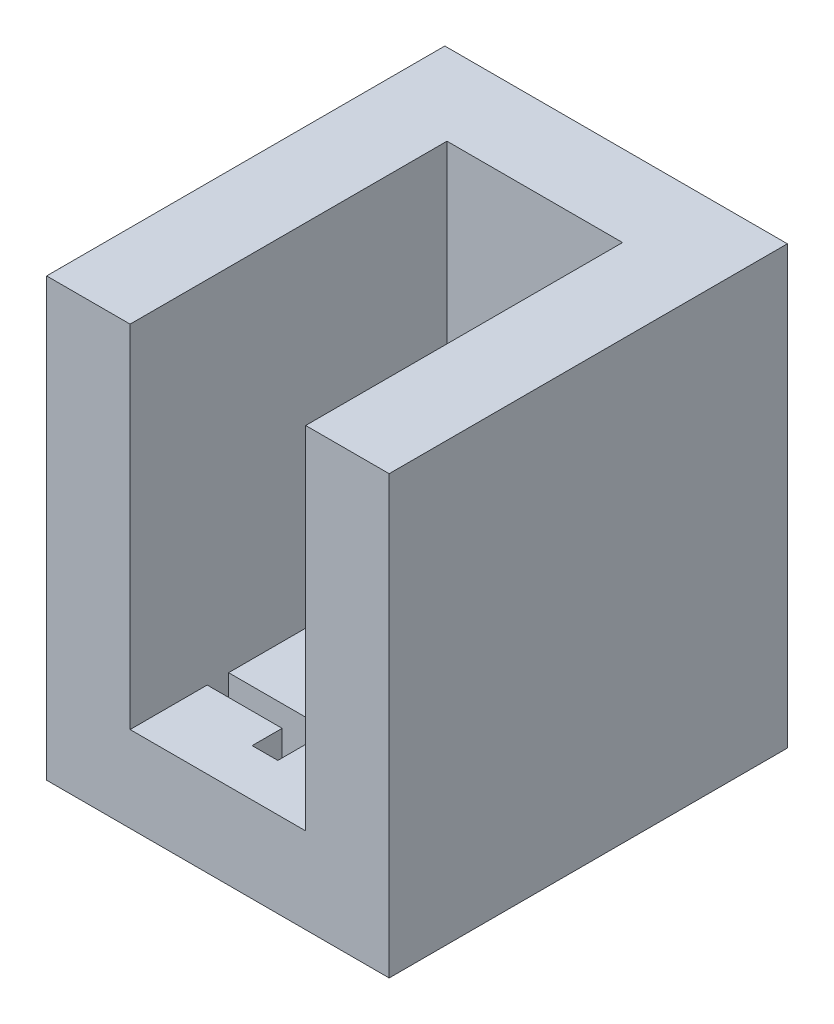
ISO-10303-21;
HEADER;
FILE_DESCRIPTION(('STEP AP214'),'2;1');
FILE_NAME('part.step','',(''),(''),'','','');
FILE_SCHEMA(('AUTOMOTIVE_DESIGN { 1 0 10303 214 1 1 1 1 }'));
ENDSEC;
DATA;
#1=APPLICATION_CONTEXT('core data for automotive mechanical design processes');
#2=APPLICATION_PROTOCOL_DEFINITION('international standard','automotive_design',2000,#1);
#3=PRODUCT_CONTEXT('',#1,'mechanical');
#4=PRODUCT('Part','Part','',(#3));
#5=PRODUCT_RELATED_PRODUCT_CATEGORY('part','',(#4));
#6=PRODUCT_DEFINITION_FORMATION('','',#4);
#7=PRODUCT_DEFINITION_CONTEXT('part definition',#1,'design');
#8=PRODUCT_DEFINITION('design','',#6,#7);
#9=PRODUCT_DEFINITION_SHAPE('','',#8);
#10=(LENGTH_UNIT() NAMED_UNIT(*) SI_UNIT(.MILLI.,.METRE.));
#11=(NAMED_UNIT(*) PLANE_ANGLE_UNIT() SI_UNIT($,.RADIAN.));
#12=(NAMED_UNIT(*) SI_UNIT($,.STERADIAN.) SOLID_ANGLE_UNIT());
#13=UNCERTAINTY_MEASURE_WITH_UNIT(LENGTH_MEASURE(1.E-05),#10,'distance_accuracy_value','');
#14=(GEOMETRIC_REPRESENTATION_CONTEXT(3) GLOBAL_UNCERTAINTY_ASSIGNED_CONTEXT((#13)) GLOBAL_UNIT_ASSIGNED_CONTEXT((#10,
#11,#12)) REPRESENTATION_CONTEXT('',''));
#15=CARTESIAN_POINT('',(0.,0.,0.));
#16=DIRECTION('',(0.,0.,1.));
#17=DIRECTION('',(1.,0.,0.));
#18=AXIS2_PLACEMENT_3D('',#15,#16,#17);
#19=CARTESIAN_POINT('',(0.,9.99999999999999,0.));
#20=DIRECTION('',(0.,1.,0.));
#21=DIRECTION('',(0.,0.,1.));
#22=AXIS2_PLACEMENT_3D('',#19,#20,#21);
#23=PLANE('',#22);
#24=DIRECTION('',(0.,0.,1.));
#25=VECTOR('',#24,1.);
#26=CARTESIAN_POINT('',(-10.25,9.99999999999999,-13.75));
#27=LINE('',#26,#25);
#28=CARTESIAN_POINT('',(-10.25,9.99999999999999,-13.75));
#29=VERTEX_POINT('',#28);
#30=CARTESIAN_POINT('',(-10.25,9.99999999999999,11.75));
#31=VERTEX_POINT('',#30);
#32=EDGE_CURVE('E210',#29,#31,#27,.T.);
#33=ORIENTED_EDGE('',*,*,#32,.T.);
#34=DIRECTION('',(1.,0.,0.));
#35=VECTOR('',#34,1.);
#36=CARTESIAN_POINT('',(-10.25,9.99999999999999,11.75));
#37=LINE('',#36,#35);
#38=CARTESIAN_POINT('',(10.25,9.99999999999999,11.75));
#39=VERTEX_POINT('',#38);
#40=EDGE_CURVE('E193',#31,#39,#37,.T.);
#41=ORIENTED_EDGE('',*,*,#40,.T.);
#42=DIRECTION('',(0.,0.,-1.));
#43=VECTOR('',#42,1.);
#44=CARTESIAN_POINT('',(10.25,9.99999999999999,-13.75));
#45=LINE('',#44,#43);
#46=CARTESIAN_POINT('',(10.25,9.99999999999999,-13.75));
#47=VERTEX_POINT('',#46);
#48=EDGE_CURVE('E217',#39,#47,#45,.T.);
#49=ORIENTED_EDGE('',*,*,#48,.T.);
#50=DIRECTION('',(-1.,0.,0.));
#51=VECTOR('',#50,1.);
#52=CARTESIAN_POINT('',(-10.25,9.99999999999999,-13.75));
#53=LINE('',#52,#51);
#54=EDGE_CURVE('E221',#47,#29,#53,.T.);
#55=ORIENTED_EDGE('',*,*,#54,.T.);
#56=EDGE_LOOP('',(#33,#41,#49,#55));
#57=FACE_BOUND('',#56,.T.);
#58=ADVANCED_FACE('F33',(#57),#23,.T.);
#59=CARTESIAN_POINT('',(20.,51.,23.25));
#60=DIRECTION('',(-1.,0.,0.));
#61=DIRECTION('',(0.,0.,1.));
#62=AXIS2_PLACEMENT_3D('',#59,#60,#61);
#63=PLANE('',#62);
#64=DIRECTION('',(0.,0.,-1.));
#65=VECTOR('',#64,1.);
#66=CARTESIAN_POINT('',(20.,0.,23.25));
#67=LINE('',#66,#65);
#68=CARTESIAN_POINT('',(20.,0.,23.25));
#69=VERTEX_POINT('',#68);
#70=CARTESIAN_POINT('',(20.,0.,-23.25));
#71=VERTEX_POINT('',#70);
#72=EDGE_CURVE('E233',#69,#71,#67,.T.);
#73=ORIENTED_EDGE('',*,*,#72,.T.);
#74=DIRECTION('',(0.,-1.,0.));
#75=VECTOR('',#74,1.);
#76=CARTESIAN_POINT('',(20.,51.,-23.25));
#77=LINE('',#76,#75);
#78=CARTESIAN_POINT('',(20.,51.,-23.25));
#79=VERTEX_POINT('',#78);
#80=EDGE_CURVE('E11',#79,#71,#77,.T.);
#81=ORIENTED_EDGE('',*,*,#80,.F.);
#82=DIRECTION('',(0.,0.,-1.));
#83=VECTOR('',#82,1.);
#84=CARTESIAN_POINT('',(20.,51.,23.25));
#85=LINE('',#84,#83);
#86=CARTESIAN_POINT('',(20.,51.,23.25));
#87=VERTEX_POINT('',#86);
#88=EDGE_CURVE('E239',#87,#79,#85,.T.);
#89=ORIENTED_EDGE('',*,*,#88,.F.);
#90=DIRECTION('',(0.,-1.,0.));
#91=VECTOR('',#90,1.);
#92=CARTESIAN_POINT('',(20.,51.,23.25));
#93=LINE('',#92,#91);
#94=EDGE_CURVE('E251',#87,#69,#93,.T.);
#95=ORIENTED_EDGE('',*,*,#94,.T.);
#96=EDGE_LOOP('',(#73,#81,#89,#95));
#97=FACE_BOUND('',#96,.T.);
#98=ADVANCED_FACE('F35',(#97),#63,.F.);
#99=CARTESIAN_POINT('',(-20.,51.,-23.25));
#100=DIRECTION('',(0.,0.,1.));
#101=DIRECTION('',(1.,0.,0.));
#102=AXIS2_PLACEMENT_3D('',#99,#100,#101);
#103=PLANE('',#102);
#104=DIRECTION('',(-1.,0.,0.));
#105=VECTOR('',#104,1.);
#106=CARTESIAN_POINT('',(-20.,0.,-23.25));
#107=LINE('',#106,#105);
#108=CARTESIAN_POINT('',(-20.,0.,-23.25));
#109=VERTEX_POINT('',#108);
#110=EDGE_CURVE('E254',#71,#109,#107,.T.);
#111=ORIENTED_EDGE('',*,*,#110,.T.);
#112=DIRECTION('',(0.,-1.,0.));
#113=VECTOR('',#112,1.);
#114=CARTESIAN_POINT('',(-20.,51.,-23.25));
#115=LINE('',#114,#113);
#116=CARTESIAN_POINT('',(-20.,51.,-23.25));
#117=VERTEX_POINT('',#116);
#118=EDGE_CURVE('E41',#117,#109,#115,.T.);
#119=ORIENTED_EDGE('',*,*,#118,.F.);
#120=DIRECTION('',(-1.,0.,0.));
#121=VECTOR('',#120,1.);
#122=CARTESIAN_POINT('',(-20.,51.,-23.25));
#123=LINE('',#122,#121);
#124=EDGE_CURVE('E242',#79,#117,#123,.T.);
#125=ORIENTED_EDGE('',*,*,#124,.F.);
#126=ORIENTED_EDGE('',*,*,#80,.T.);
#127=EDGE_LOOP('',(#111,#119,#125,#126));
#128=FACE_BOUND('',#127,.T.);
#129=ADVANCED_FACE('F318',(#128),#103,.F.);
#130=CARTESIAN_POINT('',(-20.,51.,23.25));
#131=DIRECTION('',(1.,0.,0.));
#132=DIRECTION('',(0.,0.,-1.));
#133=AXIS2_PLACEMENT_3D('',#130,#131,#132);
#134=PLANE('',#133);
#135=DIRECTION('',(0.,0.,1.));
#136=VECTOR('',#135,1.);
#137=CARTESIAN_POINT('',(-20.,0.,23.25));
#138=LINE('',#137,#136);
#139=CARTESIAN_POINT('',(-20.,0.,23.25));
#140=VERTEX_POINT('',#139);
#141=EDGE_CURVE('E256',#109,#140,#138,.T.);
#142=ORIENTED_EDGE('',*,*,#141,.T.);
#143=DIRECTION('',(0.,-1.,0.));
#144=VECTOR('',#143,1.);
#145=CARTESIAN_POINT('',(-20.,51.,23.25));
#146=LINE('',#145,#144);
#147=CARTESIAN_POINT('',(-20.,51.,23.25));
#148=VERTEX_POINT('',#147);
#149=EDGE_CURVE('E261',#148,#140,#146,.T.);
#150=ORIENTED_EDGE('',*,*,#149,.F.);
#151=DIRECTION('',(0.,0.,1.));
#152=VECTOR('',#151,1.);
#153=CARTESIAN_POINT('',(-20.,51.,23.25));
#154=LINE('',#153,#152);
#155=EDGE_CURVE('E245',#117,#148,#154,.T.);
#156=ORIENTED_EDGE('',*,*,#155,.F.);
#157=ORIENTED_EDGE('',*,*,#118,.T.);
#158=EDGE_LOOP('',(#142,#150,#156,#157));
#159=FACE_BOUND('',#158,.T.);
#160=ADVANCED_FACE('F268',(#159),#134,.F.);
#161=CARTESIAN_POINT('',(-20.,51.,23.25));
#162=DIRECTION('',(0.,0.,-1.));
#163=DIRECTION('',(-1.,0.,0.));
#164=AXIS2_PLACEMENT_3D('',#161,#162,#163);
#165=PLANE('',#164);
#166=DIRECTION('',(1.,0.,0.));
#167=VECTOR('',#166,1.);
#168=CARTESIAN_POINT('',(-10.25,9.99999999999999,23.25));
#169=LINE('',#168,#167);
#170=CARTESIAN_POINT('',(-10.25,9.99999999999999,23.25));
#171=VERTEX_POINT('',#170);
#172=CARTESIAN_POINT('',(10.25,9.99999999999999,23.25));
#173=VERTEX_POINT('',#172);
#174=EDGE_CURVE('E213',#171,#173,#169,.T.);
#175=ORIENTED_EDGE('',*,*,#174,.F.);
#176=DIRECTION('',(0.,1.,0.));
#177=VECTOR('',#176,1.);
#178=CARTESIAN_POINT('',(-10.25,9.99999999999999,23.25));
#179=LINE('',#178,#177);
#180=CARTESIAN_POINT('',(-10.25,51.,23.25));
#181=VERTEX_POINT('',#180);
#182=EDGE_CURVE('E224',#171,#181,#179,.T.);
#183=ORIENTED_EDGE('',*,*,#182,.T.);
#184=DIRECTION('',(1.,0.,0.));
#185=VECTOR('',#184,1.);
#186=CARTESIAN_POINT('',(-20.,51.,23.25));
#187=LINE('',#186,#185);
#188=EDGE_CURVE('E248',#148,#181,#187,.T.);
#189=ORIENTED_EDGE('',*,*,#188,.F.);
#190=ORIENTED_EDGE('',*,*,#149,.T.);
#191=DIRECTION('',(1.,0.,0.));
#192=VECTOR('',#191,1.);
#193=CARTESIAN_POINT('',(-20.,0.,23.25));
#194=LINE('',#193,#192);
#195=EDGE_CURVE('E243',#140,#69,#194,.T.);
#196=ORIENTED_EDGE('',*,*,#195,.T.);
#197=ORIENTED_EDGE('',*,*,#94,.F.);
#198=CARTESIAN_POINT('',(10.25,51.,23.25));
#199=VERTEX_POINT('',#198);
#200=EDGE_CURVE('E247',#199,#87,#187,.T.);
#201=ORIENTED_EDGE('',*,*,#200,.F.);
#202=DIRECTION('',(0.,1.,0.));
#203=VECTOR('',#202,1.);
#204=CARTESIAN_POINT('',(10.25,9.99999999999999,23.25));
#205=LINE('',#204,#203);
#206=EDGE_CURVE('E56',#173,#199,#205,.T.);
#207=ORIENTED_EDGE('',*,*,#206,.F.);
#208=EDGE_LOOP('',(#175,#183,#189,#190,#196,#197,#201,#207));
#209=FACE_BOUND('',#208,.T.);
#210=ADVANCED_FACE('F278',(#209),#165,.F.);
#211=CARTESIAN_POINT('',(0.,51.,0.));
#212=DIRECTION('',(0.,-1.,0.));
#213=DIRECTION('',(0.,0.,-1.));
#214=AXIS2_PLACEMENT_3D('',#211,#212,#213);
#215=PLANE('',#214);
#216=ORIENTED_EDGE('',*,*,#188,.T.);
#217=DIRECTION('',(0.,0.,1.));
#218=VECTOR('',#217,1.);
#219=CARTESIAN_POINT('',(-10.25,51.,-13.75));
#220=LINE('',#219,#218);
#221=CARTESIAN_POINT('',(-10.25,51.,-13.75));
#222=VERTEX_POINT('',#221);
#223=EDGE_CURVE('E164',#222,#181,#220,.T.);
#224=ORIENTED_EDGE('',*,*,#223,.F.);
#225=DIRECTION('',(-1.,0.,0.));
#226=VECTOR('',#225,1.);
#227=CARTESIAN_POINT('',(-10.25,51.,-13.75));
#228=LINE('',#227,#226);
#229=CARTESIAN_POINT('',(10.25,51.,-13.75));
#230=VERTEX_POINT('',#229);
#231=EDGE_CURVE('E228',#230,#222,#228,.T.);
#232=ORIENTED_EDGE('',*,*,#231,.F.);
#233=DIRECTION('',(0.,0.,-1.));
#234=VECTOR('',#233,1.);
#235=CARTESIAN_POINT('',(10.25,51.,-13.75));
#236=LINE('',#235,#234);
#237=EDGE_CURVE('E226',#199,#230,#236,.T.);
#238=ORIENTED_EDGE('',*,*,#237,.F.);
#239=ORIENTED_EDGE('',*,*,#200,.T.);
#240=ORIENTED_EDGE('',*,*,#88,.T.);
#241=ORIENTED_EDGE('',*,*,#124,.T.);
#242=ORIENTED_EDGE('',*,*,#155,.T.);
#243=EDGE_LOOP('',(#216,#224,#232,#238,#239,#240,#241,#242));
#244=FACE_BOUND('',#243,.T.);
#245=ADVANCED_FACE('F285',(#244),#215,.F.);
#246=CARTESIAN_POINT('',(0.,0.,0.));
#247=DIRECTION('',(0.,-1.,0.));
#248=DIRECTION('',(0.,0.,-1.));
#249=AXIS2_PLACEMENT_3D('',#246,#247,#248);
#250=PLANE('',#249);
#251=ORIENTED_EDGE('',*,*,#72,.F.);
#252=ORIENTED_EDGE('',*,*,#195,.F.);
#253=ORIENTED_EDGE('',*,*,#141,.F.);
#254=ORIENTED_EDGE('',*,*,#110,.F.);
#255=EDGE_LOOP('',(#251,#252,#253,#254));
#256=FACE_BOUND('',#255,.T.);
#257=ADVANCED_FACE('F274',(#256),#250,.T.);
#258=CARTESIAN_POINT('',(-10.25,9.99999999999999,-13.75));
#259=DIRECTION('',(-1.,0.,0.));
#260=DIRECTION('',(0.,0.,1.));
#261=AXIS2_PLACEMENT_3D('',#258,#259,#260);
#262=PLANE('',#261);
#263=ORIENTED_EDGE('',*,*,#223,.T.);
#264=ORIENTED_EDGE('',*,*,#182,.F.);
#265=CARTESIAN_POINT('',(-10.25,9.99999999999999,14.25));
#266=VERTEX_POINT('',#265);
#267=EDGE_CURVE('E214',#266,#171,#27,.T.);
#268=ORIENTED_EDGE('',*,*,#267,.F.);
#269=DIRECTION('',(0.,1.,0.));
#270=VECTOR('',#269,1.);
#271=CARTESIAN_POINT('',(-10.25,1.49999999999999,14.25));
#272=LINE('',#271,#270);
#273=CARTESIAN_POINT('',(-10.25,1.49999999999999,14.25));
#274=VERTEX_POINT('',#273);
#275=EDGE_CURVE('E205',#274,#266,#272,.T.);
#276=ORIENTED_EDGE('',*,*,#275,.F.);
#277=DIRECTION('',(0.,0.,1.));
#278=VECTOR('',#277,1.);
#279=CARTESIAN_POINT('',(-10.25,1.49999999999999,11.75));
#280=LINE('',#279,#278);
#281=CARTESIAN_POINT('',(-10.25,1.49999999999999,11.75));
#282=VERTEX_POINT('',#281);
#283=EDGE_CURVE('E176',#282,#274,#280,.T.);
#284=ORIENTED_EDGE('',*,*,#283,.F.);
#285=DIRECTION('',(0.,1.,0.));
#286=VECTOR('',#285,1.);
#287=CARTESIAN_POINT('',(-10.25,1.49999999999999,11.75));
#288=LINE('',#287,#286);
#289=EDGE_CURVE('E203',#282,#31,#288,.T.);
#290=ORIENTED_EDGE('',*,*,#289,.T.);
#291=ORIENTED_EDGE('',*,*,#32,.F.);
#292=DIRECTION('',(0.,1.,0.));
#293=VECTOR('',#292,1.);
#294=CARTESIAN_POINT('',(-10.25,9.99999999999999,-13.75));
#295=LINE('',#294,#293);
#296=EDGE_CURVE('E231',#29,#222,#295,.T.);
#297=ORIENTED_EDGE('',*,*,#296,.T.);
#298=EDGE_LOOP('',(#263,#264,#268,#276,#284,#290,#291,#297));
#299=FACE_BOUND('',#298,.T.);
#300=ADVANCED_FACE('F295',(#299),#262,.F.);
#301=CARTESIAN_POINT('',(-10.25,9.99999999999999,-13.75));
#302=DIRECTION('',(0.,0.,-1.));
#303=DIRECTION('',(-1.,0.,0.));
#304=AXIS2_PLACEMENT_3D('',#301,#302,#303);
#305=PLANE('',#304);
#306=ORIENTED_EDGE('',*,*,#231,.T.);
#307=ORIENTED_EDGE('',*,*,#296,.F.);
#308=ORIENTED_EDGE('',*,*,#54,.F.);
#309=DIRECTION('',(0.,1.,0.));
#310=VECTOR('',#309,1.);
#311=CARTESIAN_POINT('',(10.25,9.99999999999999,-13.75));
#312=LINE('',#311,#310);
#313=EDGE_CURVE('E234',#47,#230,#312,.T.);
#314=ORIENTED_EDGE('',*,*,#313,.T.);
#315=EDGE_LOOP('',(#306,#307,#308,#314));
#316=FACE_BOUND('',#315,.T.);
#317=ADVANCED_FACE('F299',(#316),#305,.F.);
#318=CARTESIAN_POINT('',(10.25,9.99999999999999,-13.75));
#319=DIRECTION('',(1.,0.,0.));
#320=DIRECTION('',(0.,0.,-1.));
#321=AXIS2_PLACEMENT_3D('',#318,#319,#320);
#322=PLANE('',#321);
#323=ORIENTED_EDGE('',*,*,#237,.T.);
#324=ORIENTED_EDGE('',*,*,#313,.F.);
#325=ORIENTED_EDGE('',*,*,#48,.F.);
#326=DIRECTION('',(0.,1.,0.));
#327=VECTOR('',#326,1.);
#328=CARTESIAN_POINT('',(10.25,1.49999999999999,11.75));
#329=LINE('',#328,#327);
#330=CARTESIAN_POINT('',(10.25,1.49999999999999,11.75));
#331=VERTEX_POINT('',#330);
#332=EDGE_CURVE('E201',#331,#39,#329,.T.);
#333=ORIENTED_EDGE('',*,*,#332,.F.);
#334=DIRECTION('',(0.,0.,1.));
#335=VECTOR('',#334,1.);
#336=CARTESIAN_POINT('',(10.25,1.49999999999999,11.75));
#337=LINE('',#336,#335);
#338=CARTESIAN_POINT('',(10.25,1.49999999999999,14.25));
#339=VERTEX_POINT('',#338);
#340=EDGE_CURVE('E181',#331,#339,#337,.T.);
#341=ORIENTED_EDGE('',*,*,#340,.T.);
#342=DIRECTION('',(0.,1.,0.));
#343=VECTOR('',#342,1.);
#344=CARTESIAN_POINT('',(10.25,1.49999999999999,14.25));
#345=LINE('',#344,#343);
#346=CARTESIAN_POINT('',(10.25,9.99999999999999,14.25));
#347=VERTEX_POINT('',#346);
#348=EDGE_CURVE('E199',#339,#347,#345,.T.);
#349=ORIENTED_EDGE('',*,*,#348,.T.);
#350=EDGE_CURVE('E218',#173,#347,#45,.T.);
#351=ORIENTED_EDGE('',*,*,#350,.F.);
#352=ORIENTED_EDGE('',*,*,#206,.T.);
#353=EDGE_LOOP('',(#323,#324,#325,#333,#341,#349,#351,#352));
#354=FACE_BOUND('',#353,.T.);
#355=ADVANCED_FACE('F303',(#354),#322,.F.);
#356=DIRECTION('',(1.,0.,0.));
#357=VECTOR('',#356,1.);
#358=CARTESIAN_POINT('',(-10.25,9.99999999999999,14.25));
#359=LINE('',#358,#357);
#360=CARTESIAN_POINT('',(-1.5,9.99999999999999,14.25));
#361=VERTEX_POINT('',#360);
#362=EDGE_CURVE('E190',#266,#361,#359,.T.);
#363=ORIENTED_EDGE('',*,*,#362,.F.);
#364=ORIENTED_EDGE('',*,*,#267,.T.);
#365=ORIENTED_EDGE('',*,*,#174,.T.);
#366=ORIENTED_EDGE('',*,*,#350,.T.);
#367=DIRECTION('',(1.,0.,0.));
#368=VECTOR('',#367,1.);
#369=CARTESIAN_POINT('',(1.5,9.99999999999999,14.25));
#370=LINE('',#369,#368);
#371=CARTESIAN_POINT('',(1.5,9.99999999999999,14.25));
#372=VERTEX_POINT('',#371);
#373=EDGE_CURVE('E156',#372,#347,#370,.T.);
#374=ORIENTED_EDGE('',*,*,#373,.F.);
#375=DIRECTION('',(0.,0.,1.));
#376=VECTOR('',#375,1.);
#377=CARTESIAN_POINT('',(1.5,9.99999999999999,14.25));
#378=LINE('',#377,#376);
#379=CARTESIAN_POINT('',(1.5,9.99999999999999,17.75));
#380=VERTEX_POINT('',#379);
#381=EDGE_CURVE('E48',#372,#380,#378,.T.);
#382=ORIENTED_EDGE('',*,*,#381,.T.);
#383=DIRECTION('',(1.,0.,0.));
#384=VECTOR('',#383,1.);
#385=CARTESIAN_POINT('',(-1.5,9.99999999999999,17.75));
#386=LINE('',#385,#384);
#387=CARTESIAN_POINT('',(-1.5,9.99999999999999,17.75));
#388=VERTEX_POINT('',#387);
#389=EDGE_CURVE('E163',#388,#380,#386,.T.);
#390=ORIENTED_EDGE('',*,*,#389,.F.);
#391=DIRECTION('',(0.,0.,1.));
#392=VECTOR('',#391,1.);
#393=CARTESIAN_POINT('',(-1.5,9.99999999999999,14.25));
#394=LINE('',#393,#392);
#395=EDGE_CURVE('E187',#361,#388,#394,.T.);
#396=ORIENTED_EDGE('',*,*,#395,.F.);
#397=EDGE_LOOP('',(#363,#364,#365,#366,#374,#382,#390,#396));
#398=FACE_BOUND('',#397,.T.);
#399=ADVANCED_FACE('F290',(#398),#23,.T.);
#400=CARTESIAN_POINT('',(1.5,1.49999999999999,14.25));
#401=DIRECTION('',(-1.,0.,0.));
#402=DIRECTION('',(0.,0.,1.));
#403=AXIS2_PLACEMENT_3D('',#400,#401,#402);
#404=PLANE('',#403);
#405=ORIENTED_EDGE('',*,*,#381,.F.);
#406=DIRECTION('',(0.,1.,0.));
#407=VECTOR('',#406,1.);
#408=CARTESIAN_POINT('',(1.5,1.49999999999999,14.25));
#409=LINE('',#408,#407);
#410=CARTESIAN_POINT('',(1.5,1.49999999999999,14.25));
#411=VERTEX_POINT('',#410);
#412=EDGE_CURVE('E150',#411,#372,#409,.T.);
#413=ORIENTED_EDGE('',*,*,#412,.F.);
#414=DIRECTION('',(0.,0.,1.));
#415=VECTOR('',#414,1.);
#416=CARTESIAN_POINT('',(1.5,1.49999999999999,14.25));
#417=LINE('',#416,#415);
#418=CARTESIAN_POINT('',(1.5,1.49999999999999,17.75));
#419=VERTEX_POINT('',#418);
#420=EDGE_CURVE('E145',#411,#419,#417,.T.);
#421=ORIENTED_EDGE('',*,*,#420,.T.);
#422=DIRECTION('',(0.,1.,0.));
#423=VECTOR('',#422,1.);
#424=CARTESIAN_POINT('',(1.5,1.49999999999999,17.75));
#425=LINE('',#424,#423);
#426=EDGE_CURVE('E148',#419,#380,#425,.T.);
#427=ORIENTED_EDGE('',*,*,#426,.T.);
#428=EDGE_LOOP('',(#405,#413,#421,#427));
#429=FACE_BOUND('',#428,.T.);
#430=ADVANCED_FACE('F147',(#429),#404,.T.);
#431=CARTESIAN_POINT('',(-1.5,1.49999999999999,17.75));
#432=DIRECTION('',(0.,0.,1.));
#433=DIRECTION('',(1.,0.,0.));
#434=AXIS2_PLACEMENT_3D('',#431,#432,#433);
#435=PLANE('',#434);
#436=ORIENTED_EDGE('',*,*,#389,.T.);
#437=ORIENTED_EDGE('',*,*,#426,.F.);
#438=DIRECTION('',(1.,0.,0.));
#439=VECTOR('',#438,1.);
#440=CARTESIAN_POINT('',(-1.5,1.49999999999999,17.75));
#441=LINE('',#440,#439);
#442=CARTESIAN_POINT('',(-1.5,1.49999999999999,17.75));
#443=VERTEX_POINT('',#442);
#444=EDGE_CURVE('E155',#443,#419,#441,.T.);
#445=ORIENTED_EDGE('',*,*,#444,.F.);
#446=DIRECTION('',(0.,1.,0.));
#447=VECTOR('',#446,1.);
#448=CARTESIAN_POINT('',(-1.5,1.49999999999999,17.75));
#449=LINE('',#448,#447);
#450=EDGE_CURVE('E165',#443,#388,#449,.T.);
#451=ORIENTED_EDGE('',*,*,#450,.T.);
#452=EDGE_LOOP('',(#436,#437,#445,#451));
#453=FACE_BOUND('',#452,.T.);
#454=ADVANCED_FACE('F160',(#453),#435,.F.);
#455=CARTESIAN_POINT('',(-1.5,1.49999999999999,14.25));
#456=DIRECTION('',(-1.,0.,0.));
#457=DIRECTION('',(0.,0.,1.));
#458=AXIS2_PLACEMENT_3D('',#455,#456,#457);
#459=PLANE('',#458);
#460=ORIENTED_EDGE('',*,*,#395,.T.);
#461=ORIENTED_EDGE('',*,*,#450,.F.);
#462=DIRECTION('',(0.,0.,1.));
#463=VECTOR('',#462,1.);
#464=CARTESIAN_POINT('',(-1.5,1.49999999999999,14.25));
#465=LINE('',#464,#463);
#466=CARTESIAN_POINT('',(-1.5,1.49999999999999,14.25));
#467=VERTEX_POINT('',#466);
#468=EDGE_CURVE('E170',#467,#443,#465,.T.);
#469=ORIENTED_EDGE('',*,*,#468,.F.);
#470=DIRECTION('',(0.,1.,0.));
#471=VECTOR('',#470,1.);
#472=CARTESIAN_POINT('',(-1.5,1.49999999999999,14.25));
#473=LINE('',#472,#471);
#474=EDGE_CURVE('E207',#467,#361,#473,.T.);
#475=ORIENTED_EDGE('',*,*,#474,.T.);
#476=EDGE_LOOP('',(#460,#461,#469,#475));
#477=FACE_BOUND('',#476,.T.);
#478=ADVANCED_FACE('F324',(#477),#459,.F.);
#479=CARTESIAN_POINT('',(-10.25,1.49999999999999,14.25));
#480=DIRECTION('',(0.,0.,1.));
#481=DIRECTION('',(1.,0.,0.));
#482=AXIS2_PLACEMENT_3D('',#479,#480,#481);
#483=PLANE('',#482);
#484=ORIENTED_EDGE('',*,*,#362,.T.);
#485=ORIENTED_EDGE('',*,*,#474,.F.);
#486=DIRECTION('',(1.,0.,0.));
#487=VECTOR('',#486,1.);
#488=CARTESIAN_POINT('',(-10.25,1.49999999999999,14.25));
#489=LINE('',#488,#487);
#490=EDGE_CURVE('E172',#274,#467,#489,.T.);
#491=ORIENTED_EDGE('',*,*,#490,.F.);
#492=ORIENTED_EDGE('',*,*,#275,.T.);
#493=EDGE_LOOP('',(#484,#485,#491,#492));
#494=FACE_BOUND('',#493,.T.);
#495=ADVANCED_FACE('F327',(#494),#483,.F.);
#496=CARTESIAN_POINT('',(-10.25,1.49999999999999,11.75));
#497=DIRECTION('',(0.,0.,1.));
#498=DIRECTION('',(1.,0.,0.));
#499=AXIS2_PLACEMENT_3D('',#496,#497,#498);
#500=PLANE('',#499);
#501=ORIENTED_EDGE('',*,*,#40,.F.);
#502=ORIENTED_EDGE('',*,*,#289,.F.);
#503=DIRECTION('',(1.,0.,0.));
#504=VECTOR('',#503,1.);
#505=CARTESIAN_POINT('',(-10.25,1.49999999999999,11.75));
#506=LINE('',#505,#504);
#507=EDGE_CURVE('E179',#282,#331,#506,.T.);
#508=ORIENTED_EDGE('',*,*,#507,.T.);
#509=ORIENTED_EDGE('',*,*,#332,.T.);
#510=EDGE_LOOP('',(#501,#502,#508,#509));
#511=FACE_BOUND('',#510,.T.);
#512=ADVANCED_FACE('F331',(#511),#500,.T.);
#513=CARTESIAN_POINT('',(1.5,1.49999999999999,14.25));
#514=DIRECTION('',(0.,0.,1.));
#515=DIRECTION('',(1.,0.,0.));
#516=AXIS2_PLACEMENT_3D('',#513,#514,#515);
#517=PLANE('',#516);
#518=ORIENTED_EDGE('',*,*,#373,.T.);
#519=ORIENTED_EDGE('',*,*,#348,.F.);
#520=DIRECTION('',(1.,0.,0.));
#521=VECTOR('',#520,1.);
#522=CARTESIAN_POINT('',(1.5,1.49999999999999,14.25));
#523=LINE('',#522,#521);
#524=EDGE_CURVE('E183',#411,#339,#523,.T.);
#525=ORIENTED_EDGE('',*,*,#524,.F.);
#526=ORIENTED_EDGE('',*,*,#412,.T.);
#527=EDGE_LOOP('',(#518,#519,#525,#526));
#528=FACE_BOUND('',#527,.T.);
#529=ADVANCED_FACE('F335',(#528),#517,.F.);
#530=CARTESIAN_POINT('',(0.,1.49999999999999,0.));
#531=DIRECTION('',(0.,1.,0.));
#532=DIRECTION('',(0.,0.,1.));
#533=AXIS2_PLACEMENT_3D('',#530,#531,#532);
#534=PLANE('',#533);
#535=ORIENTED_EDGE('',*,*,#420,.F.);
#536=ORIENTED_EDGE('',*,*,#524,.T.);
#537=ORIENTED_EDGE('',*,*,#340,.F.);
#538=ORIENTED_EDGE('',*,*,#507,.F.);
#539=ORIENTED_EDGE('',*,*,#283,.T.);
#540=ORIENTED_EDGE('',*,*,#490,.T.);
#541=ORIENTED_EDGE('',*,*,#468,.T.);
#542=ORIENTED_EDGE('',*,*,#444,.T.);
#543=EDGE_LOOP('',(#535,#536,#537,#538,#539,#540,#541,#542));
#544=FACE_BOUND('',#543,.T.);
#545=ADVANCED_FACE('F167',(#544),#534,.T.);
#546=CLOSED_SHELL('',(#58,#98,#129,#160,#210,#245,#257,#300,#317,#355,#399,#430,#454,#478,#495,
#512,#529,#545));
#547=MANIFOLD_SOLID_BREP('B2',#546);
#548=ADVANCED_BREP_SHAPE_REPRESENTATION('',(#18,#547),#14);
#549=SHAPE_DEFINITION_REPRESENTATION(#9,#548);
ENDSEC;
END-ISO-10303-21;
